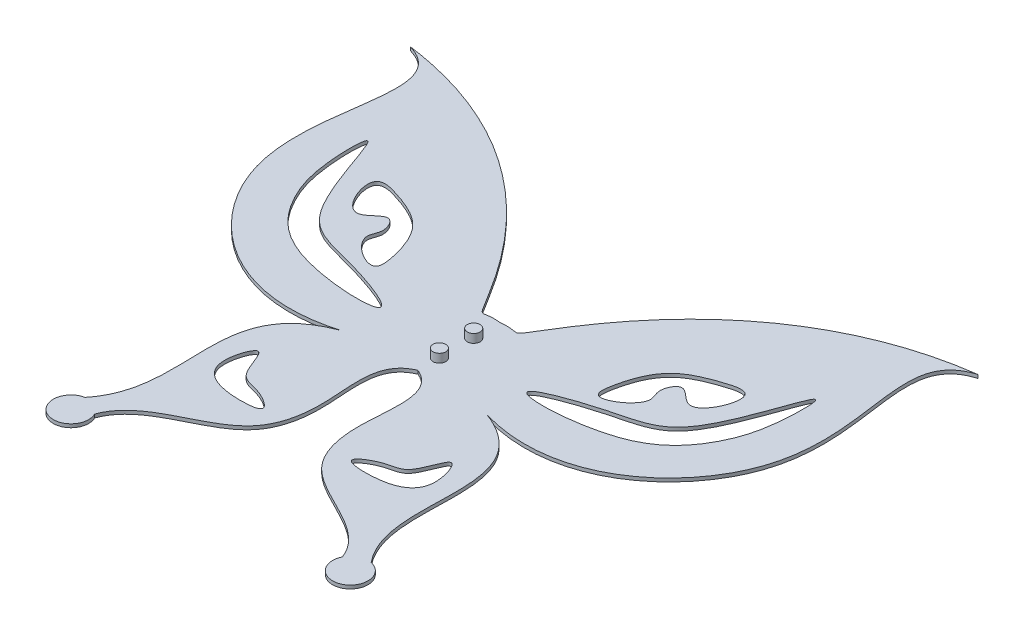
ISO-10303-21;
HEADER;
FILE_DESCRIPTION(('STEP AP214'),'2;1');
FILE_NAME('part.step','',(''),(''),'','','');
FILE_SCHEMA(('AUTOMOTIVE_DESIGN { 1 0 10303 214 1 1 1 1 }'));
ENDSEC;
DATA;
#1=APPLICATION_CONTEXT('core data for automotive mechanical design processes');
#2=APPLICATION_PROTOCOL_DEFINITION('international standard','automotive_design',2000,#1);
#3=PRODUCT_CONTEXT('',#1,'mechanical');
#4=PRODUCT('Part','Part','',(#3));
#5=PRODUCT_RELATED_PRODUCT_CATEGORY('part','',(#4));
#6=PRODUCT_DEFINITION_FORMATION('','',#4);
#7=PRODUCT_DEFINITION_CONTEXT('part definition',#1,'design');
#8=PRODUCT_DEFINITION('design','',#6,#7);
#9=PRODUCT_DEFINITION_SHAPE('','',#8);
#10=(LENGTH_UNIT() NAMED_UNIT(*) SI_UNIT(.MILLI.,.METRE.));
#11=(NAMED_UNIT(*) PLANE_ANGLE_UNIT() SI_UNIT($,.RADIAN.));
#12=(NAMED_UNIT(*) SI_UNIT($,.STERADIAN.) SOLID_ANGLE_UNIT());
#13=UNCERTAINTY_MEASURE_WITH_UNIT(LENGTH_MEASURE(1.E-05),#10,'distance_accuracy_value','');
#14=(GEOMETRIC_REPRESENTATION_CONTEXT(3) GLOBAL_UNCERTAINTY_ASSIGNED_CONTEXT((#13)) GLOBAL_UNIT_ASSIGNED_CONTEXT((#10,
#11,#12)) REPRESENTATION_CONTEXT('',''));
#15=CARTESIAN_POINT('',(0.,0.,0.));
#16=DIRECTION('',(0.,0.,1.));
#17=DIRECTION('',(1.,0.,0.));
#18=AXIS2_PLACEMENT_3D('',#15,#16,#17);
#19=CARTESIAN_POINT('',(61.2962901618316,0.8,-9.94210918208849));
#20=DIRECTION('',(0.,-1.,0.));
#21=DIRECTION('',(0.,0.,-1.));
#22=AXIS2_PLACEMENT_3D('',#19,#20,#21);
#23=PLANE('',#22);
#24=CARTESIAN_POINT('',(0.,0.8,6.21914772310618));
#25=DIRECTION('',(0.,-1.,0.));
#26=DIRECTION('',(0.,0.,-1.));
#27=AXIS2_PLACEMENT_3D('',#24,#25,#26);
#28=CIRCLE('',#27,1.5);
#29=CARTESIAN_POINT('',(0.,0.8,4.71914772310618));
#30=VERTEX_POINT('',#29);
#31=EDGE_CURVE('E45',#30,#30,#28,.F.);
#32=ORIENTED_EDGE('',*,*,#31,.F.);
#33=EDGE_LOOP('',(#32));
#34=FACE_BOUND('',#33,.T.);
#35=CARTESIAN_POINT('',(10.4184917402499,0.8,45.0127856105063));
#36=CARTESIAN_POINT('',(10.4731967023596,0.8,45.9225002865515));
#37=CARTESIAN_POINT('',(18.7591926345684,0.8,46.5456789910013));
#38=CARTESIAN_POINT('',(26.6581757542053,0.8,43.324858900846));
#39=CARTESIAN_POINT('',(22.1305801957037,0.8,30.0301863630407));
#40=CARTESIAN_POINT('',(20.1379556346862,0.8,41.588823489079));
#41=CARTESIAN_POINT('',(14.7439090964974,0.8,41.44807339908));
#42=CARTESIAN_POINT('',(10.3691204275729,0.8,44.1917667122962));
#43=CARTESIAN_POINT('',(10.4184917402499,0.8,45.0127856105063));
#44=B_SPLINE_CURVE_WITH_KNOTS('',3,(#35,#36,#37,#38,#39,#40,#41,#42,#43),.UNSPECIFIED.,.T.,.F.,
(4,1,1,1,1,1,4),(0.,0.139257971766267,0.40725852405819,0.568049583375561,0.751640500700134,
0.874319465699351,1.),.UNSPECIFIED.);
#45=CARTESIAN_POINT('',(10.4184917402499,0.8,45.0127856105063));
#46=VERTEX_POINT('',#45);
#47=EDGE_CURVE('E273',#46,#46,#44,.T.);
#48=ORIENTED_EDGE('',*,*,#47,.F.);
#49=EDGE_LOOP('',(#48));
#50=FACE_BOUND('',#49,.T.);
#51=CARTESIAN_POINT('',(25.933769110627,0.8,-0.943425663351158));
#52=CARTESIAN_POINT('',(25.5808711008807,0.8,0.647867891382443));
#53=CARTESIAN_POINT('',(24.683183655558,0.8,6.22498372191918));
#54=CARTESIAN_POINT('',(34.8980461651628,0.8,-0.397438589367131));
#55=CARTESIAN_POINT('',(31.6304568328671,0.8,-4.79265302449019));
#56=CARTESIAN_POINT('',(34.2985455775217,0.8,-10.1926891995408));
#57=CARTESIAN_POINT('',(39.9756118700505,0.8,-0.967296739636138));
#58=CARTESIAN_POINT('',(46.350131757375,0.8,-16.3519371472823));
#59=CARTESIAN_POINT('',(35.8710122478329,0.8,-13.3360121363895));
#60=CARTESIAN_POINT('',(29.1320202563256,0.8,-10.1410484816097));
#61=CARTESIAN_POINT('',(26.7718373072152,0.8,-4.72245666615253));
#62=CARTESIAN_POINT('',(25.933769110627,0.8,-0.943425663351158));
#63=B_SPLINE_CURVE_WITH_KNOTS('',3,(#51,#52,#53,#54,#55,#56,#57,#58,#59,#60,#61,#62),
.UNSPECIFIED.,.T.,.F.,(4,1,1,1,1,1,1,1,1,4),(0.,0.0695165066728017,0.220207806554272,
0.270014504929877,0.33358420358311,0.424056646815106,0.591613602391464,0.683242947624758,
0.83491101742887,1.),.UNSPECIFIED.);
#64=CARTESIAN_POINT('',(25.933769110627,0.8,-0.943425663351158));
#65=VERTEX_POINT('',#64);
#66=EDGE_CURVE('E277',#65,#65,#63,.T.);
#67=ORIENTED_EDGE('',*,*,#66,.F.);
#68=EDGE_LOOP('',(#67));
#69=FACE_BOUND('',#68,.T.);
#70=CARTESIAN_POINT('',(30.0107363245274,0.8,5.37152027865772));
#71=CARTESIAN_POINT('',(24.5947554041919,0.8,6.84436970777116));
#72=CARTESIAN_POINT('',(7.46880755753019,0.8,12.9176190069078));
#73=CARTESIAN_POINT('',(39.5648526565328,0.8,11.8300293206543));
#74=CARTESIAN_POINT('',(48.8465916491953,0.8,0.828614969039759));
#75=CARTESIAN_POINT('',(52.8096551226719,0.8,-9.47919282413836));
#76=CARTESIAN_POINT('',(53.230925245362,0.8,-31.3532958034046));
#77=CARTESIAN_POINT('',(45.900543117828,0.8,2.61786958752708));
#78=CARTESIAN_POINT('',(35.6469072048703,0.8,3.83879127063446));
#79=CARTESIAN_POINT('',(30.0107363245274,0.8,5.37152027865772));
#80=B_SPLINE_CURVE_WITH_KNOTS('',3,(#70,#71,#72,#73,#74,#75,#76,#77,#78,#79),.UNSPECIFIED.,.T.,
.F.,(4,1,1,1,1,1,1,4),(0.,0.129731757435533,0.322340195399714,0.467413737588874,
0.549712901669654,0.657094993338523,0.864993919980694,1.),.UNSPECIFIED.);
#81=CARTESIAN_POINT('',(30.0107363245274,0.8,5.37152027865772));
#82=VERTEX_POINT('',#81);
#83=EDGE_CURVE('E238',#82,#82,#80,.T.);
#84=ORIENTED_EDGE('',*,*,#83,.F.);
#85=EDGE_LOOP('',(#84));
#86=FACE_BOUND('',#85,.T.);
#87=CARTESIAN_POINT('',(17.1688459411274,0.8,20.1995104824442));
#88=CARTESIAN_POINT('',(34.2776599555108,0.8,25.1158554043101));
#89=CARTESIAN_POINT('',(51.2205741628788,0.8,15.295108955921));
#90=CARTESIAN_POINT('',(68.6229434281639,0.8,-18.0833367453675));
#91=CARTESIAN_POINT('',(51.61665154491,0.8,-40.8827044112151));
#92=CARTESIAN_POINT('',(66.1992866018102,0.8,-45.2717701922057));
#93=B_SPLINE_CURVE_WITH_KNOTS('',3,(#87,#88,#89,#90,#91,#92),.UNSPECIFIED.,.F.,.F.,(4,1,1,4),
(0.,0.326589010947708,0.403462906384856,0.981175092276255),.UNSPECIFIED.);
#94=CARTESIAN_POINT('',(17.1688459411274,0.8,20.1995104824442));
#95=VERTEX_POINT('',#94);
#96=CARTESIAN_POINT('',(66.1992866018102,0.8,-45.2717701922057));
#97=VERTEX_POINT('',#96);
#98=EDGE_CURVE('E222',#95,#97,#93,.T.);
#99=ORIENTED_EDGE('',*,*,#98,.T.);
#100=CARTESIAN_POINT('',(66.1992866018102,0.8,-45.2717701922057));
#101=CARTESIAN_POINT('',(25.1887693174494,0.8,-39.7600528242461));
#102=CARTESIAN_POINT('',(2.82114618729625,0.8,5.28859220762271));
#103=CARTESIAN_POINT('',(3.97507803744081,0.8,-0.462704260412762));
#104=CARTESIAN_POINT('',(0.,0.8,0.));
#105=B_SPLINE_CURVE_WITH_KNOTS('',3,(#100,#101,#102,#103,#104),.UNSPECIFIED.,.F.,.F.,(4,1,4),
(0.,0.746463145969101,1.),.UNSPECIFIED.);
#106=CARTESIAN_POINT('',(0.,0.8,0.));
#107=VERTEX_POINT('',#106);
#108=EDGE_CURVE('E103',#97,#107,#105,.T.);
#109=ORIENTED_EDGE('',*,*,#108,.T.);
#110=CARTESIAN_POINT('',(0.,0.8,0.));
#111=CARTESIAN_POINT('',(-3.97507803744081,0.8,-0.462704260412761));
#112=CARTESIAN_POINT('',(-2.82114618729625,0.8,5.28859220762271));
#113=CARTESIAN_POINT('',(-25.1887693174494,0.8,-39.7600528242461));
#114=CARTESIAN_POINT('',(-66.1992866018102,0.8,-45.2717701922057));
#115=B_SPLINE_CURVE_WITH_KNOTS('',3,(#110,#111,#112,#113,#114),.UNSPECIFIED.,.F.,.F.,(4,1,4),
(0.,0.253536854030899,1.),.UNSPECIFIED.);
#116=CARTESIAN_POINT('',(-66.1992866018102,0.8,-45.2717701922057));
#117=VERTEX_POINT('',#116);
#118=EDGE_CURVE('E212',#107,#117,#115,.T.);
#119=ORIENTED_EDGE('',*,*,#118,.T.);
#120=CARTESIAN_POINT('',(-66.1992866018102,0.8,-45.2717701922057));
#121=CARTESIAN_POINT('',(-51.6166516740065,0.8,-40.8827043741182));
#122=CARTESIAN_POINT('',(-68.6229431190087,0.8,-18.0833368835249));
#123=CARTESIAN_POINT('',(-51.220574730188,0.8,15.2951083328979));
#124=CARTESIAN_POINT('',(-34.2776587314961,0.8,25.1158537402019));
#125=CARTESIAN_POINT('',(-17.1688459414707,0.8,20.1995104825412));
#126=B_SPLINE_CURVE_WITH_KNOTS('',3,(#120,#121,#122,#123,#124,#125),.UNSPECIFIED.,.F.,.F.,(4,1,
1,4),(0.,0.577712185891399,0.654586079526245,0.981175074253235),.UNSPECIFIED.);
#127=CARTESIAN_POINT('',(-17.1688459414707,0.8,20.1995104825412));
#128=VERTEX_POINT('',#127);
#129=EDGE_CURVE('E191',#117,#128,#126,.T.);
#130=ORIENTED_EDGE('',*,*,#129,.T.);
#131=CARTESIAN_POINT('',(-17.1688459414707,0.8,20.1995104825412));
#132=CARTESIAN_POINT('',(-25.6018645632846,0.8,23.416880604762));
#133=CARTESIAN_POINT('',(-31.9302574861486,0.8,36.8217320545167));
#134=CARTESIAN_POINT('',(-26.5796931477405,0.8,55.2349520288766));
#135=CARTESIAN_POINT('',(-33.3962350867555,0.8,63.5513151377377));
#136=B_SPLINE_CURVE_WITH_KNOTS('',3,(#131,#132,#133,#134,#135),.UNSPECIFIED.,.F.,.F.,(4,1,4),
(0.0417034940689336,0.422179099613734,1.),.UNSPECIFIED.);
#137=CARTESIAN_POINT('',(-33.3962350867555,0.8,63.5513151377377));
#138=VERTEX_POINT('',#137);
#139=EDGE_CURVE('E186',#128,#138,#136,.T.);
#140=ORIENTED_EDGE('',*,*,#139,.T.);
#141=CARTESIAN_POINT('',(-32.5907038209745,0.8,67.6022205774403));
#142=DIRECTION('',(0.,1.,0.));
#143=DIRECTION('',(0.,0.,-1.));
#144=AXIS2_PLACEMENT_3D('',#141,#142,#143);
#145=CIRCLE('',#144,4.13021978852969);
#146=CARTESIAN_POINT('',(-28.8880399418294,0.8,65.7721944301856));
#147=VERTEX_POINT('',#146);
#148=EDGE_CURVE('E181',#138,#147,#145,.T.);
#149=ORIENTED_EDGE('',*,*,#148,.T.);
#150=CARTESIAN_POINT('',(-28.8880399418293,0.8,65.7721944301856));
#151=CARTESIAN_POINT('',(-25.6601073799437,0.8,57.0162364504777));
#152=CARTESIAN_POINT('',(-7.26629121957149,0.8,55.5186677369168));
#153=CARTESIAN_POINT('',(-2.9430325640613,0.8,35.2445923564588));
#154=CARTESIAN_POINT('',(-6.76290401197362,0.8,22.0652546328298));
#155=CARTESIAN_POINT('',(0.,0.8,19.2191477231062));
#156=B_SPLINE_CURVE_WITH_KNOTS('',3,(#150,#151,#152,#153,#154,#155),.UNSPECIFIED.,.F.,.F.,(4,1,
1,4),(0.,0.454851188555207,0.66606722085571,1.),.UNSPECIFIED.);
#157=CARTESIAN_POINT('',(0.,0.8,19.2191477231062));
#158=VERTEX_POINT('',#157);
#159=EDGE_CURVE('E128',#147,#158,#156,.T.);
#160=ORIENTED_EDGE('',*,*,#159,.T.);
#161=CARTESIAN_POINT('',(0.,0.8,19.2191477231062));
#162=CARTESIAN_POINT('',(6.76290401197362,0.8,22.0652546328298));
#163=CARTESIAN_POINT('',(2.9430325640613,0.8,35.2445923564588));
#164=CARTESIAN_POINT('',(7.26629121957151,0.8,55.5186677369168));
#165=CARTESIAN_POINT('',(25.6601073799437,0.8,57.0162364504777));
#166=CARTESIAN_POINT('',(28.8880399418294,0.8,65.7721944301856));
#167=B_SPLINE_CURVE_WITH_KNOTS('',3,(#161,#162,#163,#164,#165,#166),.UNSPECIFIED.,.F.,.F.,(4,1,
1,4),(0.,0.33393277914429,0.545148811444793,1.),.UNSPECIFIED.);
#168=CARTESIAN_POINT('',(28.8880399418294,0.8,65.7721944301856));
#169=VERTEX_POINT('',#168);
#170=EDGE_CURVE('E122',#158,#169,#167,.T.);
#171=ORIENTED_EDGE('',*,*,#170,.T.);
#172=CARTESIAN_POINT('',(32.5907038209745,0.8,67.6022205774403));
#173=DIRECTION('',(0.,1.,0.));
#174=DIRECTION('',(0.,0.,1.));
#175=AXIS2_PLACEMENT_3D('',#172,#173,#174);
#176=CIRCLE('',#175,4.13021978852969);
#177=CARTESIAN_POINT('',(33.3962350867555,0.8,63.5513151377377));
#178=VERTEX_POINT('',#177);
#179=EDGE_CURVE('E126',#169,#178,#176,.T.);
#180=ORIENTED_EDGE('',*,*,#179,.T.);
#181=CARTESIAN_POINT('',(33.3962350867555,0.8,63.5513151377377));
#182=CARTESIAN_POINT('',(26.5796916552256,0.8,55.2349514594697));
#183=CARTESIAN_POINT('',(31.9302598458047,0.8,36.8217338426135));
#184=CARTESIAN_POINT('',(25.6018623464311,0.8,23.4168807131442));
#185=CARTESIAN_POINT('',(17.1688459411274,0.8,20.1995104824442));
#186=B_SPLINE_CURVE_WITH_KNOTS('',3,(#181,#182,#183,#184,#185),.UNSPECIFIED.,.F.,.F.,(4,1,4),
(0.0417035356656929,0.619524436051959,1.),.UNSPECIFIED.);
#187=EDGE_CURVE('E53',#178,#95,#186,.T.);
#188=ORIENTED_EDGE('',*,*,#187,.T.);
#189=EDGE_LOOP('',(#99,#109,#119,#130,#140,#149,#160,#171,#180,#188));
#190=FACE_BOUND('',#189,.T.);
#191=CARTESIAN_POINT('',(-30.0107363245274,0.8,5.37152027865773));
#192=CARTESIAN_POINT('',(-35.6469072048703,0.8,3.83879127063447));
#193=CARTESIAN_POINT('',(-45.900543117828,0.8,2.61786958752709));
#194=CARTESIAN_POINT('',(-53.230925245362,0.8,-31.3532958034046));
#195=CARTESIAN_POINT('',(-52.8096551226719,0.8,-9.47919282413834));
#196=CARTESIAN_POINT('',(-48.8465916491953,0.8,0.828614969039766));
#197=CARTESIAN_POINT('',(-39.5648526565328,0.8,11.8300293206543));
#198=CARTESIAN_POINT('',(-7.46880755753019,0.8,12.9176190069078));
#199=CARTESIAN_POINT('',(-24.5947554041919,0.8,6.84436970777117));
#200=CARTESIAN_POINT('',(-30.0107363245274,0.8,5.37152027865773));
#201=B_SPLINE_CURVE_WITH_KNOTS('',3,(#191,#192,#193,#194,#195,#196,#197,#198,#199,#200),
.UNSPECIFIED.,.T.,.F.,(4,1,1,1,1,1,1,4),(0.,0.135006080019306,0.342905006661477,
0.450287098330346,0.532586262411126,0.677659804600286,0.870268242564467,1.),.UNSPECIFIED.);
#202=CARTESIAN_POINT('',(-30.0107363245274,0.8,5.37152027865773));
#203=VERTEX_POINT('',#202);
#204=EDGE_CURVE('E239',#203,#203,#201,.T.);
#205=ORIENTED_EDGE('',*,*,#204,.F.);
#206=EDGE_LOOP('',(#205));
#207=FACE_BOUND('',#206,.T.);
#208=CARTESIAN_POINT('',(-25.9337691106269,0.8,-0.94342566335115));
#209=CARTESIAN_POINT('',(-26.7718373072152,0.8,-4.72245666615253));
#210=CARTESIAN_POINT('',(-29.1320202563256,0.8,-10.1410484816096));
#211=CARTESIAN_POINT('',(-35.8710122478329,0.8,-13.3360121363895));
#212=CARTESIAN_POINT('',(-46.350131757375,0.8,-16.3519371472823));
#213=CARTESIAN_POINT('',(-39.9756118700505,0.8,-0.967296739636135));
#214=CARTESIAN_POINT('',(-34.2985455775217,0.8,-10.1926891995408));
#215=CARTESIAN_POINT('',(-31.6304568328671,0.8,-4.79265302449018));
#216=CARTESIAN_POINT('',(-34.8980461651628,0.8,-0.39743858936712));
#217=CARTESIAN_POINT('',(-24.683183655558,0.8,6.22498372191919));
#218=CARTESIAN_POINT('',(-25.5808711008807,0.8,0.647867891382451));
#219=CARTESIAN_POINT('',(-25.9337691106269,0.8,-0.94342566335115));
#220=B_SPLINE_CURVE_WITH_KNOTS('',3,(#208,#209,#210,#211,#212,#213,#214,#215,#216,#217,#218,
#219),.UNSPECIFIED.,.T.,.F.,(4,1,1,1,1,1,1,1,1,4),(0.,0.16508898257113,0.316757052375242,
0.408386397608536,0.575943353184894,0.66641579641689,0.729985495070123,0.779792193445728,
0.930483493327198,1.),.UNSPECIFIED.);
#221=CARTESIAN_POINT('',(-25.9337691106269,0.8,-0.94342566335115));
#222=VERTEX_POINT('',#221);
#223=EDGE_CURVE('E338',#222,#222,#220,.T.);
#224=ORIENTED_EDGE('',*,*,#223,.F.);
#225=EDGE_LOOP('',(#224));
#226=FACE_BOUND('',#225,.T.);
#227=CARTESIAN_POINT('',(-10.4184917402499,0.8,45.0127856105063));
#228=CARTESIAN_POINT('',(-10.3691204275729,0.8,44.1917667122962));
#229=CARTESIAN_POINT('',(-14.7439090964974,0.8,41.44807339908));
#230=CARTESIAN_POINT('',(-20.1379556346862,0.8,41.588823489079));
#231=CARTESIAN_POINT('',(-22.1305801957037,0.8,30.0301863630407));
#232=CARTESIAN_POINT('',(-26.6581757542053,0.8,43.324858900846));
#233=CARTESIAN_POINT('',(-18.7591926345684,0.8,46.5456789910013));
#234=CARTESIAN_POINT('',(-10.4731967023596,0.8,45.9225002865515));
#235=CARTESIAN_POINT('',(-10.4184917402499,0.8,45.0127856105063));
#236=B_SPLINE_CURVE_WITH_KNOTS('',3,(#227,#228,#229,#230,#231,#232,#233,#234,#235),
.UNSPECIFIED.,.T.,.F.,(4,1,1,1,1,1,4),(0.,0.125680534300649,0.248359499299866,0.431950416624439,
0.59274147594181,0.860742028233733,1.),.UNSPECIFIED.);
#237=CARTESIAN_POINT('',(-10.4184917402499,0.8,45.0127856105063));
#238=VERTEX_POINT('',#237);
#239=EDGE_CURVE('E297',#238,#238,#236,.T.);
#240=ORIENTED_EDGE('',*,*,#239,.F.);
#241=EDGE_LOOP('',(#240));
#242=FACE_BOUND('',#241,.T.);
#243=CARTESIAN_POINT('',(0.,0.8,14.2191477231062));
#244=DIRECTION('',(0.,-1.,0.));
#245=DIRECTION('',(0.,0.,-1.));
#246=AXIS2_PLACEMENT_3D('',#243,#244,#245);
#247=CIRCLE('',#246,1.5);
#248=CARTESIAN_POINT('',(0.,0.8,12.7191477231062));
#249=VERTEX_POINT('',#248);
#250=EDGE_CURVE('E11',#249,#249,#247,.F.);
#251=ORIENTED_EDGE('',*,*,#250,.F.);
#252=EDGE_LOOP('',(#251));
#253=FACE_BOUND('',#252,.T.);
#254=ADVANCED_FACE('F35',(#34,#50,#69,#86,#190,#207,#226,#242,#253),#23,.F.);
#255=CARTESIAN_POINT('',(61.2962901618316,0.,-9.94210918208849));
#256=DIRECTION('',(0.,-1.,0.));
#257=DIRECTION('',(0.,0.,-1.));
#258=AXIS2_PLACEMENT_3D('',#255,#256,#257);
#259=PLANE('',#258);
#260=CARTESIAN_POINT('',(10.4184917402499,0.,45.0127856105063));
#261=CARTESIAN_POINT('',(10.4731967023596,0.,45.9225002865515));
#262=CARTESIAN_POINT('',(18.7591926345684,0.,46.5456789910013));
#263=CARTESIAN_POINT('',(26.6581757542053,0.,43.324858900846));
#264=CARTESIAN_POINT('',(22.1305801957037,0.,30.0301863630407));
#265=CARTESIAN_POINT('',(20.1379556346862,0.,41.588823489079));
#266=CARTESIAN_POINT('',(14.7439090964974,0.,41.44807339908));
#267=CARTESIAN_POINT('',(10.3691204275729,0.,44.1917667122962));
#268=CARTESIAN_POINT('',(10.4184917402499,0.,45.0127856105063));
#269=B_SPLINE_CURVE_WITH_KNOTS('',3,(#260,#261,#262,#263,#264,#265,#266,#267,#268),
.UNSPECIFIED.,.T.,.F.,(4,1,1,1,1,1,4),(0.,0.139257971766267,0.40725852405819,0.568049583375561,
0.751640500700134,0.874319465699351,1.),.UNSPECIFIED.);
#270=CARTESIAN_POINT('',(10.4184917402499,0.,45.0127856105063));
#271=VERTEX_POINT('',#270);
#272=EDGE_CURVE('E301',#271,#271,#269,.T.);
#273=ORIENTED_EDGE('',*,*,#272,.T.);
#274=EDGE_LOOP('',(#273));
#275=FACE_BOUND('',#274,.T.);
#276=CARTESIAN_POINT('',(25.933769110627,0.,-0.943425663351158));
#277=CARTESIAN_POINT('',(25.5808711008807,0.,0.647867891382443));
#278=CARTESIAN_POINT('',(24.683183655558,0.,6.22498372191918));
#279=CARTESIAN_POINT('',(34.8980461651628,0.,-0.397438589367131));
#280=CARTESIAN_POINT('',(31.6304568328671,0.,-4.79265302449019));
#281=CARTESIAN_POINT('',(34.2985455775217,0.,-10.1926891995408));
#282=CARTESIAN_POINT('',(39.9756118700505,0.,-0.967296739636138));
#283=CARTESIAN_POINT('',(46.350131757375,0.,-16.3519371472823));
#284=CARTESIAN_POINT('',(35.8710122478329,0.,-13.3360121363895));
#285=CARTESIAN_POINT('',(29.1320202563256,0.,-10.1410484816097));
#286=CARTESIAN_POINT('',(26.7718373072152,0.,-4.72245666615253));
#287=CARTESIAN_POINT('',(25.933769110627,0.,-0.943425663351158));
#288=B_SPLINE_CURVE_WITH_KNOTS('',3,(#276,#277,#278,#279,#280,#281,#282,#283,#284,#285,#286,
#287),.UNSPECIFIED.,.T.,.F.,(4,1,1,1,1,1,1,1,1,4),(0.,0.0695165066728017,0.220207806554272,
0.270014504929877,0.33358420358311,0.424056646815106,0.591613602391464,0.683242947624758,
0.83491101742887,1.),.UNSPECIFIED.);
#289=CARTESIAN_POINT('',(25.933769110627,0.,-0.943425663351158));
#290=VERTEX_POINT('',#289);
#291=EDGE_CURVE('E344',#290,#290,#288,.T.);
#292=ORIENTED_EDGE('',*,*,#291,.T.);
#293=EDGE_LOOP('',(#292));
#294=FACE_BOUND('',#293,.T.);
#295=CARTESIAN_POINT('',(30.0107363245274,0.,5.37152027865772));
#296=CARTESIAN_POINT('',(24.5947554041919,0.,6.84436970777116));
#297=CARTESIAN_POINT('',(7.46880755753019,0.,12.9176190069078));
#298=CARTESIAN_POINT('',(39.5648526565328,0.,11.8300293206543));
#299=CARTESIAN_POINT('',(48.8465916491953,0.,0.828614969039759));
#300=CARTESIAN_POINT('',(52.8096551226719,0.,-9.47919282413836));
#301=CARTESIAN_POINT('',(53.230925245362,0.,-31.3532958034046));
#302=CARTESIAN_POINT('',(45.900543117828,0.,2.61786958752708));
#303=CARTESIAN_POINT('',(35.6469072048703,0.,3.83879127063446));
#304=CARTESIAN_POINT('',(30.0107363245274,0.,5.37152027865772));
#305=B_SPLINE_CURVE_WITH_KNOTS('',3,(#295,#296,#297,#298,#299,#300,#301,#302,#303,#304),
.UNSPECIFIED.,.T.,.F.,(4,1,1,1,1,1,1,4),(0.,0.129731757435533,0.322340195399714,
0.467413737588874,0.549712901669654,0.657094993338523,0.864993919980694,1.),.UNSPECIFIED.);
#306=CARTESIAN_POINT('',(30.0107363245274,0.,5.37152027865772));
#307=VERTEX_POINT('',#306);
#308=EDGE_CURVE('E230',#307,#307,#305,.T.);
#309=ORIENTED_EDGE('',*,*,#308,.T.);
#310=EDGE_LOOP('',(#309));
#311=FACE_BOUND('',#310,.T.);
#312=CARTESIAN_POINT('',(17.1688459411274,0.,20.1995104824442));
#313=CARTESIAN_POINT('',(34.2776599555108,0.,25.1158554043101));
#314=CARTESIAN_POINT('',(51.2205741628788,0.,15.295108955921));
#315=CARTESIAN_POINT('',(68.6229434281639,0.,-18.0833367453675));
#316=CARTESIAN_POINT('',(51.61665154491,0.,-40.8827044112151));
#317=CARTESIAN_POINT('',(66.1992866018102,0.,-45.2717701922057));
#318=B_SPLINE_CURVE_WITH_KNOTS('',3,(#312,#313,#314,#315,#316,#317),.UNSPECIFIED.,.F.,.F.,(4,1,
1,4),(0.,0.326589010947708,0.403462906384856,0.981175092276255),.UNSPECIFIED.);
#319=CARTESIAN_POINT('',(17.1688459411274,0.,20.1995104824442));
#320=VERTEX_POINT('',#319);
#321=CARTESIAN_POINT('',(66.1992866018102,0.,-45.2717701922057));
#322=VERTEX_POINT('',#321);
#323=EDGE_CURVE('E152',#320,#322,#318,.T.);
#324=ORIENTED_EDGE('',*,*,#323,.F.);
#325=CARTESIAN_POINT('',(33.3962350867555,0.,63.5513151377377));
#326=CARTESIAN_POINT('',(26.5796916552256,0.,55.2349514594697));
#327=CARTESIAN_POINT('',(31.9302598458047,0.,36.8217338426135));
#328=CARTESIAN_POINT('',(25.6018623464311,0.,23.4168807131442));
#329=CARTESIAN_POINT('',(17.1688459411274,0.,20.1995104824442));
#330=B_SPLINE_CURVE_WITH_KNOTS('',3,(#325,#326,#327,#328,#329),.UNSPECIFIED.,.F.,.F.,(4,1,4),
(0.0417035356656929,0.619524436051959,1.),.UNSPECIFIED.);
#331=CARTESIAN_POINT('',(33.3962350867555,0.,63.5513151377377));
#332=VERTEX_POINT('',#331);
#333=EDGE_CURVE('E94',#332,#320,#330,.T.);
#334=ORIENTED_EDGE('',*,*,#333,.F.);
#335=CARTESIAN_POINT('',(32.5907038209745,0.,67.6022205774403));
#336=DIRECTION('',(0.,1.,0.));
#337=DIRECTION('',(0.,0.,1.));
#338=AXIS2_PLACEMENT_3D('',#335,#336,#337);
#339=CIRCLE('',#338,4.13021978852969);
#340=CARTESIAN_POINT('',(28.8880399418294,0.,65.7721944301856));
#341=VERTEX_POINT('',#340);
#342=EDGE_CURVE('E88',#341,#332,#339,.T.);
#343=ORIENTED_EDGE('',*,*,#342,.F.);
#344=CARTESIAN_POINT('',(0.,0.,19.2191477231062));
#345=CARTESIAN_POINT('',(6.76290401197362,0.,22.0652546328298));
#346=CARTESIAN_POINT('',(2.9430325640613,0.,35.2445923564588));
#347=CARTESIAN_POINT('',(7.26629121957151,0.,55.5186677369168));
#348=CARTESIAN_POINT('',(25.6601073799437,0.,57.0162364504777));
#349=CARTESIAN_POINT('',(28.8880399418294,0.,65.7721944301856));
#350=B_SPLINE_CURVE_WITH_KNOTS('',3,(#344,#345,#346,#347,#348,#349),.UNSPECIFIED.,.F.,.F.,(4,1,
1,4),(0.,0.33393277914429,0.545148811444793,1.),.UNSPECIFIED.);
#351=CARTESIAN_POINT('',(0.,0.,19.2191477231062));
#352=VERTEX_POINT('',#351);
#353=EDGE_CURVE('E136',#352,#341,#350,.T.);
#354=ORIENTED_EDGE('',*,*,#353,.F.);
#355=CARTESIAN_POINT('',(-28.8880399418293,0.,65.7721944301856));
#356=CARTESIAN_POINT('',(-25.6601073799437,0.,57.0162364504777));
#357=CARTESIAN_POINT('',(-7.26629121957149,0.,55.5186677369168));
#358=CARTESIAN_POINT('',(-2.9430325640613,0.,35.2445923564588));
#359=CARTESIAN_POINT('',(-6.76290401197362,0.,22.0652546328298));
#360=CARTESIAN_POINT('',(0.,0.,19.2191477231062));
#361=B_SPLINE_CURVE_WITH_KNOTS('',3,(#355,#356,#357,#358,#359,#360),.UNSPECIFIED.,.F.,.F.,(4,1,
1,4),(0.,0.454851188555207,0.66606722085571,1.),.UNSPECIFIED.);
#362=CARTESIAN_POINT('',(-28.8880399418294,0.,65.7721944301856));
#363=VERTEX_POINT('',#362);
#364=EDGE_CURVE('E438',#363,#352,#361,.T.);
#365=ORIENTED_EDGE('',*,*,#364,.F.);
#366=CARTESIAN_POINT('',(-32.5907038209745,0.,67.6022205774403));
#367=DIRECTION('',(0.,1.,0.));
#368=DIRECTION('',(0.,0.,-1.));
#369=AXIS2_PLACEMENT_3D('',#366,#367,#368);
#370=CIRCLE('',#369,4.13021978852969);
#371=CARTESIAN_POINT('',(-33.3962350867555,0.,63.5513151377377));
#372=VERTEX_POINT('',#371);
#373=EDGE_CURVE('E445',#372,#363,#370,.T.);
#374=ORIENTED_EDGE('',*,*,#373,.F.);
#375=CARTESIAN_POINT('',(-17.1688459414707,0.,20.1995104825412));
#376=CARTESIAN_POINT('',(-25.6018645632846,0.,23.416880604762));
#377=CARTESIAN_POINT('',(-31.9302574861486,0.,36.8217320545167));
#378=CARTESIAN_POINT('',(-26.5796931477405,0.,55.2349520288766));
#379=CARTESIAN_POINT('',(-33.3962350867555,0.,63.5513151377377));
#380=B_SPLINE_CURVE_WITH_KNOTS('',3,(#375,#376,#377,#378,#379),.UNSPECIFIED.,.F.,.F.,(4,1,4),
(0.0417034940689336,0.422179099613734,1.),.UNSPECIFIED.);
#381=CARTESIAN_POINT('',(-17.1688459414707,0.,20.1995104825412));
#382=VERTEX_POINT('',#381);
#383=EDGE_CURVE('E450',#382,#372,#380,.T.);
#384=ORIENTED_EDGE('',*,*,#383,.F.);
#385=CARTESIAN_POINT('',(-66.1992866018102,0.,-45.2717701922057));
#386=CARTESIAN_POINT('',(-51.6166516740065,0.,-40.8827043741182));
#387=CARTESIAN_POINT('',(-68.6229431190087,0.,-18.0833368835249));
#388=CARTESIAN_POINT('',(-51.220574730188,0.,15.2951083328979));
#389=CARTESIAN_POINT('',(-34.2776587314961,0.,25.1158537402019));
#390=CARTESIAN_POINT('',(-17.1688459414707,0.,20.1995104825412));
#391=B_SPLINE_CURVE_WITH_KNOTS('',3,(#385,#386,#387,#388,#389,#390),.UNSPECIFIED.,.F.,.F.,(4,1,
1,4),(0.,0.577712185891399,0.654586079526245,0.981175074253235),.UNSPECIFIED.);
#392=CARTESIAN_POINT('',(-66.1992866018102,0.,-45.2717701922057));
#393=VERTEX_POINT('',#392);
#394=EDGE_CURVE('E454',#393,#382,#391,.T.);
#395=ORIENTED_EDGE('',*,*,#394,.F.);
#396=CARTESIAN_POINT('',(0.,0.,0.));
#397=CARTESIAN_POINT('',(-3.97507803744081,0.,-0.462704260412761));
#398=CARTESIAN_POINT('',(-2.82114618729625,0.,5.28859220762271));
#399=CARTESIAN_POINT('',(-25.1887693174494,0.,-39.7600528242461));
#400=CARTESIAN_POINT('',(-66.1992866018102,0.,-45.2717701922057));
#401=B_SPLINE_CURVE_WITH_KNOTS('',3,(#396,#397,#398,#399,#400),.UNSPECIFIED.,.F.,.F.,(4,1,4),
(0.,0.253536854030899,1.),.UNSPECIFIED.);
#402=CARTESIAN_POINT('',(0.,0.,0.));
#403=VERTEX_POINT('',#402);
#404=EDGE_CURVE('E461',#403,#393,#401,.T.);
#405=ORIENTED_EDGE('',*,*,#404,.F.);
#406=CARTESIAN_POINT('',(66.1992866018102,0.,-45.2717701922057));
#407=CARTESIAN_POINT('',(25.1887693174494,0.,-39.7600528242461));
#408=CARTESIAN_POINT('',(2.82114618729625,0.,5.28859220762271));
#409=CARTESIAN_POINT('',(3.97507803744081,0.,-0.462704260412762));
#410=CARTESIAN_POINT('',(0.,0.,0.));
#411=B_SPLINE_CURVE_WITH_KNOTS('',3,(#406,#407,#408,#409,#410),.UNSPECIFIED.,.F.,.F.,(4,1,4),
(0.,0.746463145969101,1.),.UNSPECIFIED.);
#412=EDGE_CURVE('E467',#322,#403,#411,.T.);
#413=ORIENTED_EDGE('',*,*,#412,.F.);
#414=EDGE_LOOP('',(#324,#334,#343,#354,#365,#374,#384,#395,#405,#413));
#415=FACE_BOUND('',#414,.T.);
#416=CARTESIAN_POINT('',(-30.0107363245274,0.,5.37152027865773));
#417=CARTESIAN_POINT('',(-35.6469072048703,0.,3.83879127063447));
#418=CARTESIAN_POINT('',(-45.900543117828,0.,2.61786958752709));
#419=CARTESIAN_POINT('',(-53.230925245362,0.,-31.3532958034046));
#420=CARTESIAN_POINT('',(-52.8096551226719,0.,-9.47919282413834));
#421=CARTESIAN_POINT('',(-48.8465916491953,0.,0.828614969039766));
#422=CARTESIAN_POINT('',(-39.5648526565328,0.,11.8300293206543));
#423=CARTESIAN_POINT('',(-7.46880755753019,0.,12.9176190069078));
#424=CARTESIAN_POINT('',(-24.5947554041919,0.,6.84436970777117));
#425=CARTESIAN_POINT('',(-30.0107363245274,0.,5.37152027865773));
#426=B_SPLINE_CURVE_WITH_KNOTS('',3,(#416,#417,#418,#419,#420,#421,#422,#423,#424,#425),
.UNSPECIFIED.,.T.,.F.,(4,1,1,1,1,1,1,4),(0.,0.135006080019306,0.342905006661477,
0.450287098330346,0.532586262411126,0.677659804600286,0.870268242564467,1.),.UNSPECIFIED.);
#427=CARTESIAN_POINT('',(-30.0107363245274,0.,5.37152027865773));
#428=VERTEX_POINT('',#427);
#429=EDGE_CURVE('E248',#428,#428,#426,.T.);
#430=ORIENTED_EDGE('',*,*,#429,.T.);
#431=EDGE_LOOP('',(#430));
#432=FACE_BOUND('',#431,.T.);
#433=CARTESIAN_POINT('',(-25.9337691106269,0.,-0.94342566335115));
#434=CARTESIAN_POINT('',(-26.7718373072152,0.,-4.72245666615253));
#435=CARTESIAN_POINT('',(-29.1320202563256,0.,-10.1410484816096));
#436=CARTESIAN_POINT('',(-35.8710122478329,0.,-13.3360121363895));
#437=CARTESIAN_POINT('',(-46.350131757375,0.,-16.3519371472823));
#438=CARTESIAN_POINT('',(-39.9756118700505,0.,-0.967296739636135));
#439=CARTESIAN_POINT('',(-34.2985455775217,0.,-10.1926891995408));
#440=CARTESIAN_POINT('',(-31.6304568328671,0.,-4.79265302449018));
#441=CARTESIAN_POINT('',(-34.8980461651628,0.,-0.39743858936712));
#442=CARTESIAN_POINT('',(-24.683183655558,0.,6.22498372191919));
#443=CARTESIAN_POINT('',(-25.5808711008807,0.,0.647867891382451));
#444=CARTESIAN_POINT('',(-25.9337691106269,0.,-0.94342566335115));
#445=B_SPLINE_CURVE_WITH_KNOTS('',3,(#433,#434,#435,#436,#437,#438,#439,#440,#441,#442,#443,
#444),.UNSPECIFIED.,.T.,.F.,(4,1,1,1,1,1,1,1,1,4),(0.,0.16508898257113,0.316757052375242,
0.408386397608536,0.575943353184894,0.66641579641689,0.729985495070123,0.779792193445728,
0.930483493327198,1.),.UNSPECIFIED.);
#446=CARTESIAN_POINT('',(-25.9337691106269,0.,-0.94342566335115));
#447=VERTEX_POINT('',#446);
#448=EDGE_CURVE('E292',#447,#447,#445,.T.);
#449=ORIENTED_EDGE('',*,*,#448,.T.);
#450=EDGE_LOOP('',(#449));
#451=FACE_BOUND('',#450,.T.);
#452=CARTESIAN_POINT('',(-10.4184917402499,0.,45.0127856105063));
#453=CARTESIAN_POINT('',(-10.3691204275729,0.,44.1917667122962));
#454=CARTESIAN_POINT('',(-14.7439090964974,0.,41.44807339908));
#455=CARTESIAN_POINT('',(-20.1379556346862,0.,41.588823489079));
#456=CARTESIAN_POINT('',(-22.1305801957037,0.,30.0301863630407));
#457=CARTESIAN_POINT('',(-26.6581757542053,0.,43.324858900846));
#458=CARTESIAN_POINT('',(-18.7591926345684,0.,46.5456789910013));
#459=CARTESIAN_POINT('',(-10.4731967023596,0.,45.9225002865515));
#460=CARTESIAN_POINT('',(-10.4184917402499,0.,45.0127856105063));
#461=B_SPLINE_CURVE_WITH_KNOTS('',3,(#452,#453,#454,#455,#456,#457,#458,#459,#460),
.UNSPECIFIED.,.T.,.F.,(4,1,1,1,1,1,4),(0.,0.125680534300649,0.248359499299866,0.431950416624439,
0.59274147594181,0.860742028233733,1.),.UNSPECIFIED.);
#462=CARTESIAN_POINT('',(-10.4184917402499,0.,45.0127856105063));
#463=VERTEX_POINT('',#462);
#464=EDGE_CURVE('E295',#463,#463,#461,.T.);
#465=ORIENTED_EDGE('',*,*,#464,.T.);
#466=EDGE_LOOP('',(#465));
#467=FACE_BOUND('',#466,.T.);
#468=ADVANCED_FACE('F165',(#275,#294,#311,#415,#432,#451,#467),#259,.T.);
#469=DIRECTION('',(0.,-1.,0.));
#470=VECTOR('',#469,1.);
#471=SURFACE_OF_LINEAR_EXTRUSION('',#93,#470);
#472=ORIENTED_EDGE('',*,*,#323,.T.);
#473=DIRECTION('',(0.,-1.,0.));
#474=VECTOR('',#473,1.);
#475=CARTESIAN_POINT('',(66.1992866018102,0.8,-45.2717701922057));
#476=LINE('',#475,#474);
#477=EDGE_CURVE('E407',#97,#322,#476,.T.);
#478=ORIENTED_EDGE('',*,*,#477,.F.);
#479=ORIENTED_EDGE('',*,*,#98,.F.);
#480=DIRECTION('',(0.,-1.,0.));
#481=VECTOR('',#480,1.);
#482=CARTESIAN_POINT('',(17.1688459411274,0.8,20.1995104824442));
#483=LINE('',#482,#481);
#484=EDGE_CURVE('E142',#95,#320,#483,.T.);
#485=ORIENTED_EDGE('',*,*,#484,.T.);
#486=EDGE_LOOP('',(#472,#478,#479,#485));
#487=FACE_BOUND('',#486,.T.);
#488=ADVANCED_FACE('F37',(#487),#471,.F.);
#489=DIRECTION('',(0.,-1.,0.));
#490=VECTOR('',#489,1.);
#491=SURFACE_OF_LINEAR_EXTRUSION('',#105,#490);
#492=ORIENTED_EDGE('',*,*,#412,.T.);
#493=DIRECTION('',(0.,-1.,0.));
#494=VECTOR('',#493,1.);
#495=CARTESIAN_POINT('',(0.,0.8,0.));
#496=LINE('',#495,#494);
#497=EDGE_CURVE('E408',#107,#403,#496,.T.);
#498=ORIENTED_EDGE('',*,*,#497,.F.);
#499=ORIENTED_EDGE('',*,*,#108,.F.);
#500=ORIENTED_EDGE('',*,*,#477,.T.);
#501=EDGE_LOOP('',(#492,#498,#499,#500));
#502=FACE_BOUND('',#501,.T.);
#503=ADVANCED_FACE('F209',(#502),#491,.F.);
#504=DIRECTION('',(0.,-1.,0.));
#505=VECTOR('',#504,1.);
#506=SURFACE_OF_LINEAR_EXTRUSION('',#115,#505);
#507=ORIENTED_EDGE('',*,*,#404,.T.);
#508=DIRECTION('',(0.,-1.,0.));
#509=VECTOR('',#508,1.);
#510=CARTESIAN_POINT('',(-66.1992866018102,0.8,-45.2717701922057));
#511=LINE('',#510,#509);
#512=EDGE_CURVE('E413',#117,#393,#511,.T.);
#513=ORIENTED_EDGE('',*,*,#512,.F.);
#514=ORIENTED_EDGE('',*,*,#118,.F.);
#515=ORIENTED_EDGE('',*,*,#497,.T.);
#516=EDGE_LOOP('',(#507,#513,#514,#515));
#517=FACE_BOUND('',#516,.T.);
#518=ADVANCED_FACE('F206',(#517),#506,.F.);
#519=DIRECTION('',(0.,-1.,0.));
#520=VECTOR('',#519,1.);
#521=SURFACE_OF_LINEAR_EXTRUSION('',#126,#520);
#522=ORIENTED_EDGE('',*,*,#394,.T.);
#523=DIRECTION('',(0.,-1.,0.));
#524=VECTOR('',#523,1.);
#525=CARTESIAN_POINT('',(-17.1688459414707,0.8,20.1995104825412));
#526=LINE('',#525,#524);
#527=EDGE_CURVE('E416',#128,#382,#526,.T.);
#528=ORIENTED_EDGE('',*,*,#527,.F.);
#529=ORIENTED_EDGE('',*,*,#129,.F.);
#530=ORIENTED_EDGE('',*,*,#512,.T.);
#531=EDGE_LOOP('',(#522,#528,#529,#530));
#532=FACE_BOUND('',#531,.T.);
#533=ADVANCED_FACE('F202',(#532),#521,.F.);
#534=DIRECTION('',(0.,-1.,0.));
#535=VECTOR('',#534,1.);
#536=SURFACE_OF_LINEAR_EXTRUSION('',#136,#535);
#537=ORIENTED_EDGE('',*,*,#383,.T.);
#538=DIRECTION('',(0.,-1.,0.));
#539=VECTOR('',#538,1.);
#540=CARTESIAN_POINT('',(-33.3962350867555,0.8,63.5513151377377));
#541=LINE('',#540,#539);
#542=EDGE_CURVE('E419',#138,#372,#541,.T.);
#543=ORIENTED_EDGE('',*,*,#542,.F.);
#544=ORIENTED_EDGE('',*,*,#139,.F.);
#545=ORIENTED_EDGE('',*,*,#527,.T.);
#546=EDGE_LOOP('',(#537,#543,#544,#545));
#547=FACE_BOUND('',#546,.T.);
#548=ADVANCED_FACE('F199',(#547),#536,.F.);
#549=CARTESIAN_POINT('',(-32.5907038209745,0.8,67.6022205774403));
#550=DIRECTION('',(0.,-1.,0.));
#551=DIRECTION('',(0.,0.,-1.));
#552=AXIS2_PLACEMENT_3D('',#549,#550,#551);
#553=CYLINDRICAL_SURFACE('',#552,4.13021978852969);
#554=ORIENTED_EDGE('',*,*,#373,.T.);
#555=DIRECTION('',(0.,-1.,0.));
#556=VECTOR('',#555,1.);
#557=CARTESIAN_POINT('',(-28.8880399418294,0.8,65.7721944301856));
#558=LINE('',#557,#556);
#559=EDGE_CURVE('E422',#147,#363,#558,.T.);
#560=ORIENTED_EDGE('',*,*,#559,.F.);
#561=ORIENTED_EDGE('',*,*,#148,.F.);
#562=ORIENTED_EDGE('',*,*,#542,.T.);
#563=EDGE_LOOP('',(#554,#560,#561,#562));
#564=FACE_BOUND('',#563,.T.);
#565=ADVANCED_FACE('F174',(#564),#553,.T.);
#566=DIRECTION('',(0.,-1.,0.));
#567=VECTOR('',#566,1.);
#568=SURFACE_OF_LINEAR_EXTRUSION('',#156,#567);
#569=ORIENTED_EDGE('',*,*,#364,.T.);
#570=DIRECTION('',(0.,-1.,0.));
#571=VECTOR('',#570,1.);
#572=CARTESIAN_POINT('',(0.,0.8,19.2191477231062));
#573=LINE('',#572,#571);
#574=EDGE_CURVE('E137',#158,#352,#573,.T.);
#575=ORIENTED_EDGE('',*,*,#574,.F.);
#576=ORIENTED_EDGE('',*,*,#159,.F.);
#577=ORIENTED_EDGE('',*,*,#559,.T.);
#578=EDGE_LOOP('',(#569,#575,#576,#577));
#579=FACE_BOUND('',#578,.T.);
#580=ADVANCED_FACE('F171',(#579),#568,.F.);
#581=DIRECTION('',(0.,-1.,0.));
#582=VECTOR('',#581,1.);
#583=SURFACE_OF_LINEAR_EXTRUSION('',#167,#582);
#584=ORIENTED_EDGE('',*,*,#353,.T.);
#585=DIRECTION('',(0.,-1.,0.));
#586=VECTOR('',#585,1.);
#587=CARTESIAN_POINT('',(28.8880399418294,0.8,65.7721944301856));
#588=LINE('',#587,#586);
#589=EDGE_CURVE('E133',#169,#341,#588,.T.);
#590=ORIENTED_EDGE('',*,*,#589,.F.);
#591=ORIENTED_EDGE('',*,*,#170,.F.);
#592=ORIENTED_EDGE('',*,*,#574,.T.);
#593=EDGE_LOOP('',(#584,#590,#591,#592));
#594=FACE_BOUND('',#593,.T.);
#595=ADVANCED_FACE('F134',(#594),#583,.F.);
#596=CARTESIAN_POINT('',(32.5907038209745,0.8,67.6022205774403));
#597=DIRECTION('',(0.,-1.,0.));
#598=DIRECTION('',(0.,0.,-1.));
#599=AXIS2_PLACEMENT_3D('',#596,#597,#598);
#600=CYLINDRICAL_SURFACE('',#599,4.13021978852969);
#601=ORIENTED_EDGE('',*,*,#342,.T.);
#602=DIRECTION('',(0.,-1.,0.));
#603=VECTOR('',#602,1.);
#604=CARTESIAN_POINT('',(33.3962350867555,0.8,63.5513151377377));
#605=LINE('',#604,#603);
#606=EDGE_CURVE('E138',#178,#332,#605,.T.);
#607=ORIENTED_EDGE('',*,*,#606,.F.);
#608=ORIENTED_EDGE('',*,*,#179,.F.);
#609=ORIENTED_EDGE('',*,*,#589,.T.);
#610=EDGE_LOOP('',(#601,#607,#608,#609));
#611=FACE_BOUND('',#610,.T.);
#612=ADVANCED_FACE('F140',(#611),#600,.T.);
#613=DIRECTION('',(0.,-1.,0.));
#614=VECTOR('',#613,1.);
#615=SURFACE_OF_LINEAR_EXTRUSION('',#186,#614);
#616=ORIENTED_EDGE('',*,*,#333,.T.);
#617=ORIENTED_EDGE('',*,*,#484,.F.);
#618=ORIENTED_EDGE('',*,*,#187,.F.);
#619=ORIENTED_EDGE('',*,*,#606,.T.);
#620=EDGE_LOOP('',(#616,#617,#618,#619));
#621=FACE_BOUND('',#620,.T.);
#622=ADVANCED_FACE('F160',(#621),#615,.F.);
#623=DIRECTION('',(0.,-1.,0.));
#624=VECTOR('',#623,1.);
#625=SURFACE_OF_LINEAR_EXTRUSION('',#80,#624);
#626=ORIENTED_EDGE('',*,*,#83,.T.);
#627=EDGE_LOOP('',(#626));
#628=FACE_BOUND('',#627,.T.);
#629=ORIENTED_EDGE('',*,*,#308,.F.);
#630=EDGE_LOOP('',(#629));
#631=FACE_BOUND('',#630,.T.);
#632=ADVANCED_FACE('F164',(#628,#631),#625,.T.);
#633=DIRECTION('',(0.,-1.,0.));
#634=VECTOR('',#633,1.);
#635=SURFACE_OF_LINEAR_EXTRUSION('',#201,#634);
#636=ORIENTED_EDGE('',*,*,#204,.T.);
#637=EDGE_LOOP('',(#636));
#638=FACE_BOUND('',#637,.T.);
#639=ORIENTED_EDGE('',*,*,#429,.F.);
#640=EDGE_LOOP('',(#639));
#641=FACE_BOUND('',#640,.T.);
#642=ADVANCED_FACE('F258',(#638,#641),#635,.T.);
#643=DIRECTION('',(0.,-1.,0.));
#644=VECTOR('',#643,1.);
#645=SURFACE_OF_LINEAR_EXTRUSION('',#63,#644);
#646=ORIENTED_EDGE('',*,*,#66,.T.);
#647=EDGE_LOOP('',(#646));
#648=FACE_BOUND('',#647,.T.);
#649=ORIENTED_EDGE('',*,*,#291,.F.);
#650=EDGE_LOOP('',(#649));
#651=FACE_BOUND('',#650,.T.);
#652=ADVANCED_FACE('F335',(#648,#651),#645,.T.);
#653=DIRECTION('',(0.,-1.,0.));
#654=VECTOR('',#653,1.);
#655=SURFACE_OF_LINEAR_EXTRUSION('',#220,#654);
#656=ORIENTED_EDGE('',*,*,#223,.T.);
#657=EDGE_LOOP('',(#656));
#658=FACE_BOUND('',#657,.T.);
#659=ORIENTED_EDGE('',*,*,#448,.F.);
#660=EDGE_LOOP('',(#659));
#661=FACE_BOUND('',#660,.T.);
#662=ADVANCED_FACE('F331',(#658,#661),#655,.T.);
#663=DIRECTION('',(0.,-1.,0.));
#664=VECTOR('',#663,1.);
#665=SURFACE_OF_LINEAR_EXTRUSION('',#44,#664);
#666=ORIENTED_EDGE('',*,*,#47,.T.);
#667=EDGE_LOOP('',(#666));
#668=FACE_BOUND('',#667,.T.);
#669=ORIENTED_EDGE('',*,*,#272,.F.);
#670=EDGE_LOOP('',(#669));
#671=FACE_BOUND('',#670,.T.);
#672=ADVANCED_FACE('F326',(#668,#671),#665,.T.);
#673=DIRECTION('',(0.,-1.,0.));
#674=VECTOR('',#673,1.);
#675=SURFACE_OF_LINEAR_EXTRUSION('',#236,#674);
#676=ORIENTED_EDGE('',*,*,#239,.T.);
#677=EDGE_LOOP('',(#676));
#678=FACE_BOUND('',#677,.T.);
#679=ORIENTED_EDGE('',*,*,#464,.F.);
#680=EDGE_LOOP('',(#679));
#681=FACE_BOUND('',#680,.T.);
#682=ADVANCED_FACE('F330',(#678,#681),#675,.T.);
#683=CARTESIAN_POINT('',(0.,2.8,6.21914772310618));
#684=DIRECTION('',(0.,-1.,0.));
#685=DIRECTION('',(0.,0.,-1.));
#686=AXIS2_PLACEMENT_3D('',#683,#684,#685);
#687=CYLINDRICAL_SURFACE('',#686,1.5);
#688=CARTESIAN_POINT('',(0.,2.8,6.21914772310618));
#689=DIRECTION('',(0.,1.,0.));
#690=DIRECTION('',(0.,0.,1.));
#691=AXIS2_PLACEMENT_3D('',#688,#689,#690);
#692=CIRCLE('',#691,1.5);
#693=CARTESIAN_POINT('',(0.,2.8,7.71914772310618));
#694=VERTEX_POINT('',#693);
#695=EDGE_CURVE('E298',#694,#694,#692,.T.);
#696=ORIENTED_EDGE('',*,*,#695,.F.);
#697=EDGE_LOOP('',(#696));
#698=FACE_BOUND('',#697,.T.);
#699=ORIENTED_EDGE('',*,*,#31,.T.);
#700=EDGE_LOOP('',(#699));
#701=FACE_BOUND('',#700,.T.);
#702=ADVANCED_FACE('F395',(#698,#701),#687,.T.);
#703=CARTESIAN_POINT('',(0.,2.8,6.21914772310618));
#704=DIRECTION('',(0.,1.,0.));
#705=DIRECTION('',(0.,0.,1.));
#706=AXIS2_PLACEMENT_3D('',#703,#704,#705);
#707=PLANE('',#706);
#708=ORIENTED_EDGE('',*,*,#695,.T.);
#709=EDGE_LOOP('',(#708));
#710=FACE_BOUND('',#709,.T.);
#711=ADVANCED_FACE('F386',(#710),#707,.T.);
#712=CARTESIAN_POINT('',(0.,2.8,14.2191477231062));
#713=DIRECTION('',(0.,-1.,0.));
#714=DIRECTION('',(0.,0.,-1.));
#715=AXIS2_PLACEMENT_3D('',#712,#713,#714);
#716=CYLINDRICAL_SURFACE('',#715,1.5);
#717=CARTESIAN_POINT('',(0.,2.8,14.2191477231062));
#718=DIRECTION('',(0.,1.,0.));
#719=DIRECTION('',(0.,0.,1.));
#720=AXIS2_PLACEMENT_3D('',#717,#718,#719);
#721=CIRCLE('',#720,1.5);
#722=CARTESIAN_POINT('',(0.,2.8,15.7191477231062));
#723=VERTEX_POINT('',#722);
#724=EDGE_CURVE('E304',#723,#723,#721,.T.);
#725=ORIENTED_EDGE('',*,*,#724,.F.);
#726=EDGE_LOOP('',(#725));
#727=FACE_BOUND('',#726,.T.);
#728=ORIENTED_EDGE('',*,*,#250,.T.);
#729=EDGE_LOOP('',(#728));
#730=FACE_BOUND('',#729,.T.);
#731=ADVANCED_FACE('F383',(#727,#730),#716,.T.);
#732=CARTESIAN_POINT('',(0.,2.8,14.2191477231062));
#733=DIRECTION('',(0.,1.,0.));
#734=DIRECTION('',(0.,0.,1.));
#735=AXIS2_PLACEMENT_3D('',#732,#733,#734);
#736=PLANE('',#735);
#737=ORIENTED_EDGE('',*,*,#724,.T.);
#738=EDGE_LOOP('',(#737));
#739=FACE_BOUND('',#738,.T.);
#740=ADVANCED_FACE('F385',(#739),#736,.T.);
#741=CLOSED_SHELL('',(#254,#468,#488,#503,#518,#533,#548,#565,#580,#595,#612,#622,#632,#642,
#652,#662,#672,#682,#702,#711,#731,#740));
#742=MANIFOLD_SOLID_BREP('B2',#741);
#743=ADVANCED_BREP_SHAPE_REPRESENTATION('',(#18,#742),#14);
#744=SHAPE_DEFINITION_REPRESENTATION(#9,#743);
ENDSEC;
END-ISO-10303-21;
